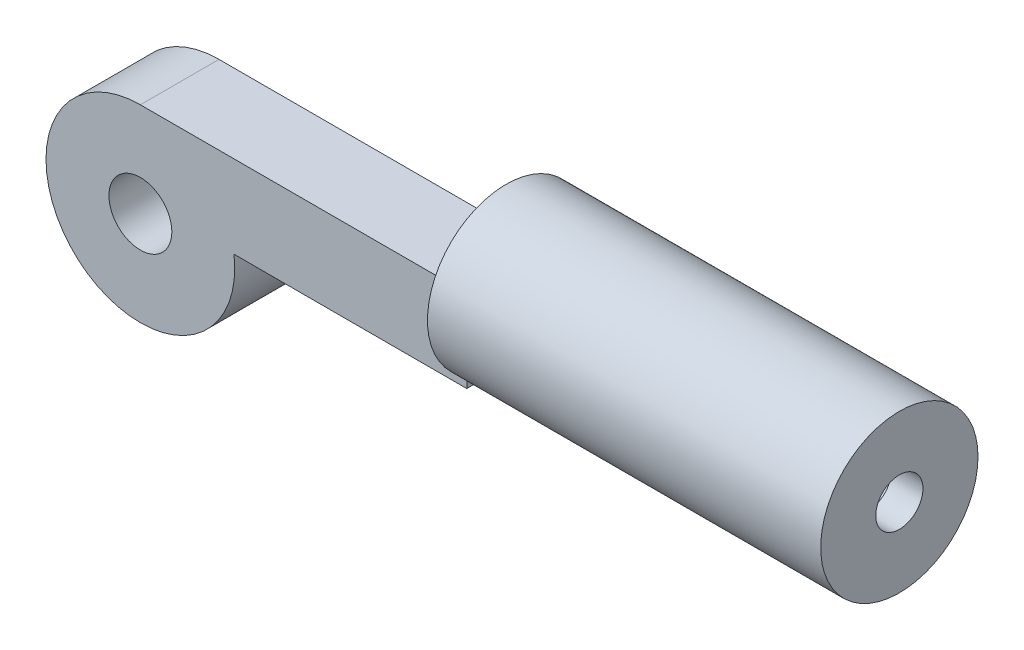
ISO-10303-21;
HEADER;
FILE_DESCRIPTION(('STEP AP214'),'2;1');
FILE_NAME('part.step','',(''),(''),'','','');
FILE_SCHEMA(('AUTOMOTIVE_DESIGN { 1 0 10303 214 1 1 1 1 }'));
ENDSEC;
DATA;
#1=APPLICATION_CONTEXT('core data for automotive mechanical design processes');
#2=APPLICATION_PROTOCOL_DEFINITION('international standard','automotive_design',2000,#1);
#3=PRODUCT_CONTEXT('',#1,'mechanical');
#4=PRODUCT('Part','Part','',(#3));
#5=PRODUCT_RELATED_PRODUCT_CATEGORY('part','',(#4));
#6=PRODUCT_DEFINITION_FORMATION('','',#4);
#7=PRODUCT_DEFINITION_CONTEXT('part definition',#1,'design');
#8=PRODUCT_DEFINITION('design','',#6,#7);
#9=PRODUCT_DEFINITION_SHAPE('','',#8);
#10=(LENGTH_UNIT() NAMED_UNIT(*) SI_UNIT(.MILLI.,.METRE.));
#11=(NAMED_UNIT(*) PLANE_ANGLE_UNIT() SI_UNIT($,.RADIAN.));
#12=(NAMED_UNIT(*) SI_UNIT($,.STERADIAN.) SOLID_ANGLE_UNIT());
#13=UNCERTAINTY_MEASURE_WITH_UNIT(LENGTH_MEASURE(1.E-05),#10,'distance_accuracy_value','');
#14=(GEOMETRIC_REPRESENTATION_CONTEXT(3) GLOBAL_UNCERTAINTY_ASSIGNED_CONTEXT((#13)) GLOBAL_UNIT_ASSIGNED_CONTEXT((#10,
#11,#12)) REPRESENTATION_CONTEXT('',''));
#15=CARTESIAN_POINT('',(0.,0.,0.));
#16=DIRECTION('',(0.,0.,1.));
#17=DIRECTION('',(1.,0.,0.));
#18=AXIS2_PLACEMENT_3D('',#15,#16,#17);
#19=CARTESIAN_POINT('',(415.,0.,0.));
#20=DIRECTION('',(1.,0.,0.));
#21=DIRECTION('',(0.,0.,-1.));
#22=AXIS2_PLACEMENT_3D('',#19,#20,#21);
#23=PLANE('',#22);
#24=CARTESIAN_POINT('',(415.,115.,50.));
#25=DIRECTION('',(1.,0.,0.));
#26=DIRECTION('',(0.,0.,-1.));
#27=AXIS2_PLACEMENT_3D('',#24,#25,#26);
#28=CIRCLE('',#27,100.);
#29=CARTESIAN_POINT('',(415.,28.3974596215561,100.));
#30=VERTEX_POINT('',#29);
#31=CARTESIAN_POINT('',(415.,15.,50.));
#32=VERTEX_POINT('',#31);
#33=EDGE_CURVE('E51',#30,#32,#28,.T.);
#34=ORIENTED_EDGE('',*,*,#33,.F.);
#35=DIRECTION('',(0.,1.,0.));
#36=VECTOR('',#35,1.);
#37=CARTESIAN_POINT('',(415.,15.,100.));
#38=LINE('',#37,#36);
#39=CARTESIAN_POINT('',(415.,15.,100.));
#40=VERTEX_POINT('',#39);
#41=EDGE_CURVE('E137',#40,#30,#38,.T.);
#42=ORIENTED_EDGE('',*,*,#41,.F.);
#43=DIRECTION('',(0.,0.,1.));
#44=VECTOR('',#43,1.);
#45=CARTESIAN_POINT('',(415.,15.,0.));
#46=LINE('',#45,#44);
#47=EDGE_CURVE('E142',#32,#40,#46,.T.);
#48=ORIENTED_EDGE('',*,*,#47,.F.);
#49=EDGE_LOOP('',(#34,#42,#48));
#50=FACE_BOUND('',#49,.T.);
#51=ADVANCED_FACE('F39',(#50),#23,.T.);
#52=CARTESIAN_POINT('',(0.,0.,100.));
#53=DIRECTION('',(0.,0.,-1.));
#54=DIRECTION('',(-1.,0.,0.));
#55=AXIS2_PLACEMENT_3D('',#52,#53,#54);
#56=CYLINDRICAL_SURFACE('',#55,120.);
#57=CARTESIAN_POINT('',(0.,0.,100.));
#58=DIRECTION('',(0.,0.,1.));
#59=DIRECTION('',(1.,0.,0.));
#60=AXIS2_PLACEMENT_3D('',#57,#58,#59);
#61=CIRCLE('',#60,120.);
#62=CARTESIAN_POINT('',(0.,120.,100.));
#63=VERTEX_POINT('',#62);
#64=CARTESIAN_POINT('',(119.058808997907,15.,100.));
#65=VERTEX_POINT('',#64);
#66=EDGE_CURVE('E49',#63,#65,#61,.T.);
#67=ORIENTED_EDGE('',*,*,#66,.F.);
#68=DIRECTION('',(0.,0.,-1.));
#69=VECTOR('',#68,1.);
#70=CARTESIAN_POINT('',(0.,120.,100.));
#71=LINE('',#70,#69);
#72=CARTESIAN_POINT('',(0.,120.,0.));
#73=VERTEX_POINT('',#72);
#74=EDGE_CURVE('E121',#73,#63,#71,.F.);
#75=ORIENTED_EDGE('',*,*,#74,.F.);
#76=CARTESIAN_POINT('',(0.,0.,0.));
#77=DIRECTION('',(0.,0.,1.));
#78=DIRECTION('',(1.,0.,0.));
#79=AXIS2_PLACEMENT_3D('',#76,#77,#78);
#80=CIRCLE('',#79,120.);
#81=CARTESIAN_POINT('',(119.058808997907,15.,0.));
#82=VERTEX_POINT('',#81);
#83=EDGE_CURVE('E43',#73,#82,#80,.T.);
#84=ORIENTED_EDGE('',*,*,#83,.T.);
#85=DIRECTION('',(0.,0.,-1.));
#86=VECTOR('',#85,1.);
#87=CARTESIAN_POINT('',(119.058808997907,15.,100.));
#88=LINE('',#87,#86);
#89=EDGE_CURVE('E105',#82,#65,#88,.F.);
#90=ORIENTED_EDGE('',*,*,#89,.T.);
#91=EDGE_LOOP('',(#67,#75,#84,#90));
#92=FACE_BOUND('',#91,.T.);
#93=ADVANCED_FACE('F41',(#92),#56,.T.);
#94=CARTESIAN_POINT('',(0.,0.,100.));
#95=DIRECTION('',(0.,0.,1.));
#96=DIRECTION('',(1.,0.,0.));
#97=AXIS2_PLACEMENT_3D('',#94,#95,#96);
#98=PLANE('',#97);
#99=CARTESIAN_POINT('',(0.,0.,100.));
#100=DIRECTION('',(0.,0.,1.));
#101=DIRECTION('',(1.,0.,0.));
#102=AXIS2_PLACEMENT_3D('',#99,#100,#101);
#103=CIRCLE('',#102,40.);
#104=CARTESIAN_POINT('',(40.,0.,100.));
#105=VERTEX_POINT('',#104);
#106=EDGE_CURVE('E145',#105,#105,#103,.T.);
#107=ORIENTED_EDGE('',*,*,#106,.F.);
#108=EDGE_LOOP('',(#107));
#109=FACE_BOUND('',#108,.T.);
#110=ORIENTED_EDGE('',*,*,#66,.T.);
#111=DIRECTION('',(1.,0.,0.));
#112=VECTOR('',#111,1.);
#113=CARTESIAN_POINT('',(-120.001,15.,100.));
#114=LINE('',#113,#112);
#115=EDGE_CURVE('E136',#65,#40,#114,.T.);
#116=ORIENTED_EDGE('',*,*,#115,.T.);
#117=ORIENTED_EDGE('',*,*,#41,.T.);
#118=CARTESIAN_POINT('',(415.,120.,100.));
#119=VERTEX_POINT('',#118);
#120=EDGE_CURVE('E114',#30,#119,#38,.T.);
#121=ORIENTED_EDGE('',*,*,#120,.T.);
#122=DIRECTION('',(1.,0.,0.));
#123=VECTOR('',#122,1.);
#124=CARTESIAN_POINT('',(-120.001,120.,100.));
#125=LINE('',#124,#123);
#126=EDGE_CURVE('E124',#63,#119,#125,.T.);
#127=ORIENTED_EDGE('',*,*,#126,.F.);
#128=EDGE_LOOP('',(#110,#116,#117,#121,#127));
#129=FACE_BOUND('',#128,.T.);
#130=ADVANCED_FACE('F174',(#109,#129),#98,.T.);
#131=CARTESIAN_POINT('',(0.,0.,0.));
#132=DIRECTION('',(0.,0.,1.));
#133=DIRECTION('',(1.,0.,0.));
#134=AXIS2_PLACEMENT_3D('',#131,#132,#133);
#135=PLANE('',#134);
#136=CARTESIAN_POINT('',(0.,0.,0.));
#137=DIRECTION('',(0.,0.,1.));
#138=DIRECTION('',(1.,0.,0.));
#139=AXIS2_PLACEMENT_3D('',#136,#137,#138);
#140=CIRCLE('',#139,40.);
#141=CARTESIAN_POINT('',(40.,0.,0.));
#142=VERTEX_POINT('',#141);
#143=EDGE_CURVE('E157',#142,#142,#140,.T.);
#144=ORIENTED_EDGE('',*,*,#143,.T.);
#145=EDGE_LOOP('',(#144));
#146=FACE_BOUND('',#145,.T.);
#147=ORIENTED_EDGE('',*,*,#83,.F.);
#148=DIRECTION('',(1.,0.,0.));
#149=VECTOR('',#148,1.);
#150=CARTESIAN_POINT('',(-120.001,120.,0.));
#151=LINE('',#150,#149);
#152=CARTESIAN_POINT('',(415.,120.,0.));
#153=VERTEX_POINT('',#152);
#154=EDGE_CURVE('E99',#73,#153,#151,.T.);
#155=ORIENTED_EDGE('',*,*,#154,.T.);
#156=DIRECTION('',(0.,-1.,0.));
#157=VECTOR('',#156,1.);
#158=CARTESIAN_POINT('',(415.,15.,0.));
#159=LINE('',#158,#157);
#160=CARTESIAN_POINT('',(415.,28.3974596215561,0.));
#161=VERTEX_POINT('',#160);
#162=EDGE_CURVE('E93',#153,#161,#159,.T.);
#163=ORIENTED_EDGE('',*,*,#162,.T.);
#164=CARTESIAN_POINT('',(415.,15.,0.));
#165=VERTEX_POINT('',#164);
#166=EDGE_CURVE('E96',#161,#165,#159,.T.);
#167=ORIENTED_EDGE('',*,*,#166,.T.);
#168=DIRECTION('',(1.,0.,0.));
#169=VECTOR('',#168,1.);
#170=CARTESIAN_POINT('',(-120.001,15.,0.));
#171=LINE('',#170,#169);
#172=EDGE_CURVE('E140',#82,#165,#171,.T.);
#173=ORIENTED_EDGE('',*,*,#172,.F.);
#174=EDGE_LOOP('',(#147,#155,#163,#167,#173));
#175=FACE_BOUND('',#174,.T.);
#176=ADVANCED_FACE('F94',(#146,#175),#135,.F.);
#177=CARTESIAN_POINT('',(0.,0.,0.));
#178=DIRECTION('',(0.,0.,1.));
#179=DIRECTION('',(1.,0.,0.));
#180=AXIS2_PLACEMENT_3D('',#177,#178,#179);
#181=CYLINDRICAL_SURFACE('',#180,40.);
#182=ORIENTED_EDGE('',*,*,#143,.F.);
#183=EDGE_LOOP('',(#182));
#184=FACE_BOUND('',#183,.T.);
#185=ORIENTED_EDGE('',*,*,#106,.T.);
#186=EDGE_LOOP('',(#185));
#187=FACE_BOUND('',#186,.T.);
#188=ADVANCED_FACE('F186',(#184,#187),#181,.F.);
#189=EDGE_CURVE('E11',#32,#161,#28,.T.);
#190=ORIENTED_EDGE('',*,*,#189,.F.);
#191=EDGE_CURVE('E109',#165,#32,#46,.T.);
#192=ORIENTED_EDGE('',*,*,#191,.F.);
#193=ORIENTED_EDGE('',*,*,#166,.F.);
#194=EDGE_LOOP('',(#190,#192,#193));
#195=FACE_BOUND('',#194,.T.);
#196=ADVANCED_FACE('F107',(#195),#23,.T.);
#197=CARTESIAN_POINT('',(-120.001,120.,0.));
#198=DIRECTION('',(0.,-1.,0.));
#199=DIRECTION('',(0.,0.,-1.));
#200=AXIS2_PLACEMENT_3D('',#197,#198,#199);
#201=PLANE('',#200);
#202=ORIENTED_EDGE('',*,*,#154,.F.);
#203=ORIENTED_EDGE('',*,*,#74,.T.);
#204=ORIENTED_EDGE('',*,*,#126,.T.);
#205=DIRECTION('',(0.,0.,-1.));
#206=VECTOR('',#205,1.);
#207=CARTESIAN_POINT('',(415.,120.,0.));
#208=LINE('',#207,#206);
#209=EDGE_CURVE('E133',#119,#153,#208,.T.);
#210=ORIENTED_EDGE('',*,*,#209,.T.);
#211=EDGE_LOOP('',(#202,#203,#204,#210));
#212=FACE_BOUND('',#211,.T.);
#213=ADVANCED_FACE('F178',(#212),#201,.F.);
#214=CARTESIAN_POINT('',(-120.001,15.,0.));
#215=DIRECTION('',(0.,1.,0.));
#216=DIRECTION('',(0.,0.,1.));
#217=AXIS2_PLACEMENT_3D('',#214,#215,#216);
#218=PLANE('',#217);
#219=ORIENTED_EDGE('',*,*,#89,.F.);
#220=ORIENTED_EDGE('',*,*,#172,.T.);
#221=ORIENTED_EDGE('',*,*,#191,.T.);
#222=ORIENTED_EDGE('',*,*,#47,.T.);
#223=ORIENTED_EDGE('',*,*,#115,.F.);
#224=EDGE_LOOP('',(#219,#220,#221,#222,#223));
#225=FACE_BOUND('',#224,.T.);
#226=ADVANCED_FACE('F173',(#225),#218,.F.);
#227=CARTESIAN_POINT('',(415.,115.,50.));
#228=DIRECTION('',(1.,0.,0.));
#229=DIRECTION('',(0.,0.,-1.));
#230=AXIS2_PLACEMENT_3D('',#227,#228,#229);
#231=CYLINDRICAL_SURFACE('',#230,100.);
#232=ORIENTED_EDGE('',*,*,#33,.T.);
#233=ORIENTED_EDGE('',*,*,#189,.T.);
#234=EDGE_CURVE('E52',#161,#30,#28,.T.);
#235=ORIENTED_EDGE('',*,*,#234,.T.);
#236=EDGE_LOOP('',(#232,#233,#235));
#237=FACE_BOUND('',#236,.T.);
#238=CARTESIAN_POINT('',(915.,115.,50.));
#239=DIRECTION('',(1.,0.,0.));
#240=DIRECTION('',(0.,0.,-1.));
#241=AXIS2_PLACEMENT_3D('',#238,#239,#240);
#242=CIRCLE('',#241,100.);
#243=CARTESIAN_POINT('',(915.,115.,-50.));
#244=VERTEX_POINT('',#243);
#245=EDGE_CURVE('E117',#244,#244,#242,.T.);
#246=ORIENTED_EDGE('',*,*,#245,.F.);
#247=EDGE_LOOP('',(#246));
#248=FACE_BOUND('',#247,.T.);
#249=ADVANCED_FACE('F118',(#237,#248),#231,.T.);
#250=CARTESIAN_POINT('',(415.,115.,50.));
#251=DIRECTION('',(1.,0.,0.));
#252=DIRECTION('',(0.,0.,-1.));
#253=AXIS2_PLACEMENT_3D('',#250,#251,#252);
#254=PLANE('',#253);
#255=ORIENTED_EDGE('',*,*,#162,.F.);
#256=ORIENTED_EDGE('',*,*,#209,.F.);
#257=ORIENTED_EDGE('',*,*,#120,.F.);
#258=ORIENTED_EDGE('',*,*,#234,.F.);
#259=EDGE_LOOP('',(#255,#256,#257,#258));
#260=FACE_BOUND('',#259,.T.);
#261=ADVANCED_FACE('F113',(#260),#254,.F.);
#262=CARTESIAN_POINT('',(915.,115.,50.));
#263=DIRECTION('',(1.,0.,0.));
#264=DIRECTION('',(0.,0.,-1.));
#265=AXIS2_PLACEMENT_3D('',#262,#263,#264);
#266=PLANE('',#265);
#267=CARTESIAN_POINT('',(915.,115.,50.));
#268=DIRECTION('',(1.,0.,0.));
#269=DIRECTION('',(0.,0.,-1.));
#270=AXIS2_PLACEMENT_3D('',#267,#268,#269);
#271=CIRCLE('',#270,30.);
#272=CARTESIAN_POINT('',(915.,115.,20.));
#273=VERTEX_POINT('',#272);
#274=EDGE_CURVE('E128',#273,#273,#271,.T.);
#275=ORIENTED_EDGE('',*,*,#274,.F.);
#276=EDGE_LOOP('',(#275));
#277=FACE_BOUND('',#276,.T.);
#278=ORIENTED_EDGE('',*,*,#245,.T.);
#279=EDGE_LOOP('',(#278));
#280=FACE_BOUND('',#279,.T.);
#281=ADVANCED_FACE('F243',(#277,#280),#266,.T.);
#282=CARTESIAN_POINT('',(875.,115.,50.));
#283=DIRECTION('',(1.,0.,0.));
#284=DIRECTION('',(0.,0.,-1.));
#285=AXIS2_PLACEMENT_3D('',#282,#283,#284);
#286=CYLINDRICAL_SURFACE('',#285,30.);
#287=CARTESIAN_POINT('',(875.,115.,50.));
#288=DIRECTION('',(1.,0.,0.));
#289=DIRECTION('',(0.,0.,-1.));
#290=AXIS2_PLACEMENT_3D('',#287,#288,#289);
#291=CIRCLE('',#290,30.);
#292=CARTESIAN_POINT('',(875.,115.,20.));
#293=VERTEX_POINT('',#292);
#294=EDGE_CURVE('E299',#293,#293,#291,.T.);
#295=ORIENTED_EDGE('',*,*,#294,.F.);
#296=EDGE_LOOP('',(#295));
#297=FACE_BOUND('',#296,.T.);
#298=ORIENTED_EDGE('',*,*,#274,.T.);
#299=EDGE_LOOP('',(#298));
#300=FACE_BOUND('',#299,.T.);
#301=ADVANCED_FACE('F252',(#297,#300),#286,.F.);
#302=CARTESIAN_POINT('',(835.,115.,50.));
#303=DIRECTION('',(1.,0.,0.));
#304=DIRECTION('',(0.,0.,-1.));
#305=AXIS2_PLACEMENT_3D('',#302,#303,#304);
#306=CYLINDRICAL_SURFACE('',#305,60.);
#307=CARTESIAN_POINT('',(835.,115.,50.));
#308=DIRECTION('',(1.,0.,0.));
#309=DIRECTION('',(0.,0.,-1.));
#310=AXIS2_PLACEMENT_3D('',#307,#308,#309);
#311=CIRCLE('',#310,60.);
#312=CARTESIAN_POINT('',(835.,115.,-9.99999999999999));
#313=VERTEX_POINT('',#312);
#314=EDGE_CURVE('E305',#313,#313,#311,.T.);
#315=ORIENTED_EDGE('',*,*,#314,.F.);
#316=EDGE_LOOP('',(#315));
#317=FACE_BOUND('',#316,.T.);
#318=CARTESIAN_POINT('',(875.,115.,50.));
#319=DIRECTION('',(1.,0.,0.));
#320=DIRECTION('',(0.,0.,-1.));
#321=AXIS2_PLACEMENT_3D('',#318,#319,#320);
#322=CIRCLE('',#321,60.);
#323=CARTESIAN_POINT('',(875.,115.,-9.99999999999999));
#324=VERTEX_POINT('',#323);
#325=EDGE_CURVE('E302',#324,#324,#322,.T.);
#326=ORIENTED_EDGE('',*,*,#325,.T.);
#327=EDGE_LOOP('',(#326));
#328=FACE_BOUND('',#327,.T.);
#329=ADVANCED_FACE('F262',(#317,#328),#306,.F.);
#330=CARTESIAN_POINT('',(835.,115.,50.));
#331=DIRECTION('',(1.,0.,0.));
#332=DIRECTION('',(0.,0.,-1.));
#333=AXIS2_PLACEMENT_3D('',#330,#331,#332);
#334=PLANE('',#333);
#335=ORIENTED_EDGE('',*,*,#314,.T.);
#336=EDGE_LOOP('',(#335));
#337=FACE_BOUND('',#336,.T.);
#338=ADVANCED_FACE('F272',(#337),#334,.T.);
#339=CARTESIAN_POINT('',(875.,115.,50.));
#340=DIRECTION('',(1.,0.,0.));
#341=DIRECTION('',(0.,0.,-1.));
#342=AXIS2_PLACEMENT_3D('',#339,#340,#341);
#343=PLANE('',#342);
#344=ORIENTED_EDGE('',*,*,#294,.T.);
#345=EDGE_LOOP('',(#344));
#346=FACE_BOUND('',#345,.T.);
#347=ORIENTED_EDGE('',*,*,#325,.F.);
#348=EDGE_LOOP('',(#347));
#349=FACE_BOUND('',#348,.T.);
#350=ADVANCED_FACE('F282',(#346,#349),#343,.F.);
#351=CLOSED_SHELL('',(#51,#93,#130,#176,#188,#196,#213,#226,#249,#261,#281,#301,#329,#338,#350));
#352=MANIFOLD_SOLID_BREP('B2',#351);
#353=ADVANCED_BREP_SHAPE_REPRESENTATION('',(#18,#352),#14);
#354=SHAPE_DEFINITION_REPRESENTATION(#9,#353);
ENDSEC;
END-ISO-10303-21;
